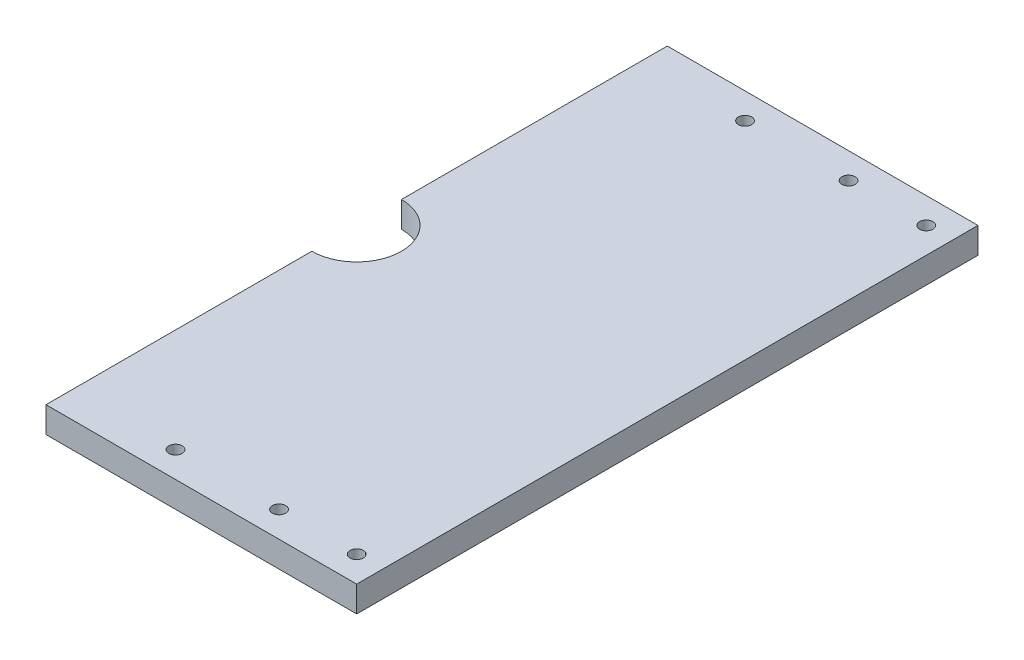
ISO-10303-21;
HEADER;
FILE_DESCRIPTION(('STEP AP214'),'2;1');
FILE_NAME('part.step','',(''),(''),'','','');
FILE_SCHEMA(('AUTOMOTIVE_DESIGN { 1 0 10303 214 1 1 1 1 }'));
ENDSEC;
DATA;
#1=APPLICATION_CONTEXT('core data for automotive mechanical design processes');
#2=APPLICATION_PROTOCOL_DEFINITION('international standard','automotive_design',2000,#1);
#3=PRODUCT_CONTEXT('',#1,'mechanical');
#4=PRODUCT('Part','Part','',(#3));
#5=PRODUCT_RELATED_PRODUCT_CATEGORY('part','',(#4));
#6=PRODUCT_DEFINITION_FORMATION('','',#4);
#7=PRODUCT_DEFINITION_CONTEXT('part definition',#1,'design');
#8=PRODUCT_DEFINITION('design','',#6,#7);
#9=PRODUCT_DEFINITION_SHAPE('','',#8);
#10=(LENGTH_UNIT() NAMED_UNIT(*) SI_UNIT(.MILLI.,.METRE.));
#11=(NAMED_UNIT(*) PLANE_ANGLE_UNIT() SI_UNIT($,.RADIAN.));
#12=(NAMED_UNIT(*) SI_UNIT($,.STERADIAN.) SOLID_ANGLE_UNIT());
#13=UNCERTAINTY_MEASURE_WITH_UNIT(LENGTH_MEASURE(1.E-05),#10,'distance_accuracy_value','');
#14=(GEOMETRIC_REPRESENTATION_CONTEXT(3) GLOBAL_UNCERTAINTY_ASSIGNED_CONTEXT((#13)) GLOBAL_UNIT_ASSIGNED_CONTEXT((#10,
#11,#12)) REPRESENTATION_CONTEXT('',''));
#15=CARTESIAN_POINT('',(0.,0.,0.));
#16=DIRECTION('',(0.,0.,1.));
#17=DIRECTION('',(1.,0.,0.));
#18=AXIS2_PLACEMENT_3D('',#15,#16,#17);
#19=CARTESIAN_POINT('',(0.,6.35,0.));
#20=DIRECTION('',(0.,1.,0.));
#21=DIRECTION('',(0.,0.,1.));
#22=AXIS2_PLACEMENT_3D('',#19,#20,#21);
#23=PLANE('',#22);
#24=CARTESIAN_POINT('',(50.82,6.35,69.85));
#25=DIRECTION('',(0.,1.,0.));
#26=DIRECTION('',(0.,0.,-1.));
#27=AXIS2_PLACEMENT_3D('',#24,#25,#26);
#28=CIRCLE('',#27,1.63194999999999);
#29=CARTESIAN_POINT('',(50.82,6.35,68.21805));
#30=VERTEX_POINT('',#29);
#31=EDGE_CURVE('E220',#30,#30,#28,.T.);
#32=ORIENTED_EDGE('',*,*,#31,.F.);
#33=EDGE_LOOP('',(#32));
#34=FACE_BOUND('',#33,.T.);
#35=CARTESIAN_POINT('',(50.82,6.35,-69.85));
#36=DIRECTION('',(0.,1.,0.));
#37=DIRECTION('',(0.,0.,1.));
#38=AXIS2_PLACEMENT_3D('',#35,#36,#37);
#39=CIRCLE('',#38,1.63194999999999);
#40=CARTESIAN_POINT('',(50.82,6.35,-68.21805));
#41=VERTEX_POINT('',#40);
#42=EDGE_CURVE('E236',#41,#41,#39,.T.);
#43=ORIENTED_EDGE('',*,*,#42,.F.);
#44=EDGE_LOOP('',(#43));
#45=FACE_BOUND('',#44,.T.);
#46=CARTESIAN_POINT('',(69.87,6.35,-69.85));
#47=DIRECTION('',(0.,1.,0.));
#48=DIRECTION('',(0.,0.,1.));
#49=AXIS2_PLACEMENT_3D('',#46,#47,#48);
#50=CIRCLE('',#49,1.63194999999999);
#51=CARTESIAN_POINT('',(69.87,6.35,-68.21805));
#52=VERTEX_POINT('',#51);
#53=EDGE_CURVE('E134',#52,#52,#50,.T.);
#54=ORIENTED_EDGE('',*,*,#53,.F.);
#55=EDGE_LOOP('',(#54));
#56=FACE_BOUND('',#55,.T.);
#57=DIRECTION('',(0.,0.,1.));
#58=VECTOR('',#57,1.);
#59=CARTESIAN_POINT('',(0.,6.35,-76.2));
#60=LINE('',#59,#58);
#61=CARTESIAN_POINT('',(0.,6.35,-76.2));
#62=VERTEX_POINT('',#61);
#63=CARTESIAN_POINT('',(0.,6.35,-11.));
#64=VERTEX_POINT('',#63);
#65=EDGE_CURVE('E146',#62,#64,#60,.T.);
#66=ORIENTED_EDGE('',*,*,#65,.T.);
#67=CARTESIAN_POINT('',(0.,6.35,0.));
#68=DIRECTION('',(0.,-1.,0.));
#69=DIRECTION('',(0.,0.,1.));
#70=AXIS2_PLACEMENT_3D('',#67,#68,#69);
#71=CIRCLE('',#70,11.);
#72=CARTESIAN_POINT('',(0.,6.35,11.));
#73=VERTEX_POINT('',#72);
#74=EDGE_CURVE('E94',#64,#73,#71,.T.);
#75=ORIENTED_EDGE('',*,*,#74,.T.);
#76=DIRECTION('',(0.,0.,1.));
#77=VECTOR('',#76,1.);
#78=CARTESIAN_POINT('',(0.,6.35,11.));
#79=LINE('',#78,#77);
#80=CARTESIAN_POINT('',(0.,6.35,76.2));
#81=VERTEX_POINT('',#80);
#82=EDGE_CURVE('E107',#73,#81,#79,.T.);
#83=ORIENTED_EDGE('',*,*,#82,.T.);
#84=DIRECTION('',(1.,0.,0.));
#85=VECTOR('',#84,1.);
#86=CARTESIAN_POINT('',(0.,6.35,76.2));
#87=LINE('',#86,#85);
#88=CARTESIAN_POINT('',(76.22,6.35,76.2));
#89=VERTEX_POINT('',#88);
#90=EDGE_CURVE('E101',#81,#89,#87,.T.);
#91=ORIENTED_EDGE('',*,*,#90,.T.);
#92=DIRECTION('',(0.,0.,-1.));
#93=VECTOR('',#92,1.);
#94=CARTESIAN_POINT('',(76.22,6.35,-76.2));
#95=LINE('',#94,#93);
#96=CARTESIAN_POINT('',(76.22,6.35,-76.2));
#97=VERTEX_POINT('',#96);
#98=EDGE_CURVE('E105',#89,#97,#95,.T.);
#99=ORIENTED_EDGE('',*,*,#98,.T.);
#100=DIRECTION('',(-1.,0.,0.));
#101=VECTOR('',#100,1.);
#102=CARTESIAN_POINT('',(0.,6.35,-76.2));
#103=LINE('',#102,#101);
#104=EDGE_CURVE('E57',#97,#62,#103,.T.);
#105=ORIENTED_EDGE('',*,*,#104,.T.);
#106=EDGE_LOOP('',(#66,#75,#83,#91,#99,#105));
#107=FACE_BOUND('',#106,.T.);
#108=CARTESIAN_POINT('',(69.87,6.35,69.85));
#109=DIRECTION('',(0.,1.,0.));
#110=DIRECTION('',(0.,0.,-1.));
#111=AXIS2_PLACEMENT_3D('',#108,#109,#110);
#112=CIRCLE('',#111,1.63194999999999);
#113=CARTESIAN_POINT('',(69.87,6.35,68.21805));
#114=VERTEX_POINT('',#113);
#115=EDGE_CURVE('E244',#114,#114,#112,.T.);
#116=ORIENTED_EDGE('',*,*,#115,.F.);
#117=EDGE_LOOP('',(#116));
#118=FACE_BOUND('',#117,.T.);
#119=CARTESIAN_POINT('',(25.42,6.35,-69.85));
#120=DIRECTION('',(0.,1.,0.));
#121=DIRECTION('',(0.,0.,1.));
#122=AXIS2_PLACEMENT_3D('',#119,#120,#121);
#123=CIRCLE('',#122,1.63195);
#124=CARTESIAN_POINT('',(25.42,6.35,-68.21805));
#125=VERTEX_POINT('',#124);
#126=EDGE_CURVE('E228',#125,#125,#123,.T.);
#127=ORIENTED_EDGE('',*,*,#126,.F.);
#128=EDGE_LOOP('',(#127));
#129=FACE_BOUND('',#128,.T.);
#130=CARTESIAN_POINT('',(25.42,6.35,69.85));
#131=DIRECTION('',(0.,1.,0.));
#132=DIRECTION('',(0.,0.,-1.));
#133=AXIS2_PLACEMENT_3D('',#130,#131,#132);
#134=CIRCLE('',#133,1.63195);
#135=CARTESIAN_POINT('',(25.42,6.35,68.21805));
#136=VERTEX_POINT('',#135);
#137=EDGE_CURVE('E209',#136,#136,#134,.T.);
#138=ORIENTED_EDGE('',*,*,#137,.F.);
#139=EDGE_LOOP('',(#138));
#140=FACE_BOUND('',#139,.T.);
#141=ADVANCED_FACE('F39',(#34,#45,#56,#107,#118,#129,#140),#23,.T.);
#142=CARTESIAN_POINT('',(0.,0.,0.));
#143=DIRECTION('',(0.,1.,0.));
#144=DIRECTION('',(0.,0.,1.));
#145=AXIS2_PLACEMENT_3D('',#142,#143,#144);
#146=PLANE('',#145);
#147=DIRECTION('',(0.,0.,1.));
#148=VECTOR('',#147,1.);
#149=CARTESIAN_POINT('',(0.,0.,-76.2));
#150=LINE('',#149,#148);
#151=CARTESIAN_POINT('',(0.,0.,-76.2));
#152=VERTEX_POINT('',#151);
#153=CARTESIAN_POINT('',(0.,0.,-11.));
#154=VERTEX_POINT('',#153);
#155=EDGE_CURVE('E129',#152,#154,#150,.T.);
#156=ORIENTED_EDGE('',*,*,#155,.F.);
#157=DIRECTION('',(-1.,0.,0.));
#158=VECTOR('',#157,1.);
#159=CARTESIAN_POINT('',(0.,0.,-76.2));
#160=LINE('',#159,#158);
#161=CARTESIAN_POINT('',(76.22,0.,-76.2));
#162=VERTEX_POINT('',#161);
#163=EDGE_CURVE('E86',#162,#152,#160,.T.);
#164=ORIENTED_EDGE('',*,*,#163,.F.);
#165=DIRECTION('',(0.,0.,-1.));
#166=VECTOR('',#165,1.);
#167=CARTESIAN_POINT('',(76.22,0.,-76.2));
#168=LINE('',#167,#166);
#169=CARTESIAN_POINT('',(76.22,0.,76.2));
#170=VERTEX_POINT('',#169);
#171=EDGE_CURVE('E80',#170,#162,#168,.T.);
#172=ORIENTED_EDGE('',*,*,#171,.F.);
#173=DIRECTION('',(1.,0.,0.));
#174=VECTOR('',#173,1.);
#175=CARTESIAN_POINT('',(0.,0.,76.2));
#176=LINE('',#175,#174);
#177=CARTESIAN_POINT('',(0.,0.,76.2));
#178=VERTEX_POINT('',#177);
#179=EDGE_CURVE('E116',#178,#170,#176,.T.);
#180=ORIENTED_EDGE('',*,*,#179,.F.);
#181=DIRECTION('',(0.,0.,1.));
#182=VECTOR('',#181,1.);
#183=CARTESIAN_POINT('',(0.,0.,11.));
#184=LINE('',#183,#182);
#185=CARTESIAN_POINT('',(0.,0.,11.));
#186=VERTEX_POINT('',#185);
#187=EDGE_CURVE('E137',#186,#178,#184,.T.);
#188=ORIENTED_EDGE('',*,*,#187,.F.);
#189=CARTESIAN_POINT('',(0.,0.,0.));
#190=DIRECTION('',(0.,-1.,0.));
#191=DIRECTION('',(0.,0.,1.));
#192=AXIS2_PLACEMENT_3D('',#189,#190,#191);
#193=CIRCLE('',#192,11.);
#194=EDGE_CURVE('E133',#154,#186,#193,.T.);
#195=ORIENTED_EDGE('',*,*,#194,.F.);
#196=EDGE_LOOP('',(#156,#164,#172,#180,#188,#195));
#197=FACE_BOUND('',#196,.T.);
#198=CARTESIAN_POINT('',(69.87,0.,-69.85));
#199=DIRECTION('',(0.,1.,0.));
#200=DIRECTION('',(0.,0.,1.));
#201=AXIS2_PLACEMENT_3D('',#198,#199,#200);
#202=CIRCLE('',#201,1.63194999999999);
#203=CARTESIAN_POINT('',(69.87,0.,-68.21805));
#204=VERTEX_POINT('',#203);
#205=EDGE_CURVE('E248',#204,#204,#202,.T.);
#206=ORIENTED_EDGE('',*,*,#205,.T.);
#207=EDGE_LOOP('',(#206));
#208=FACE_BOUND('',#207,.T.);
#209=CARTESIAN_POINT('',(69.87,0.,69.85));
#210=DIRECTION('',(0.,1.,0.));
#211=DIRECTION('',(0.,0.,-1.));
#212=AXIS2_PLACEMENT_3D('',#209,#210,#211);
#213=CIRCLE('',#212,1.63194999999999);
#214=CARTESIAN_POINT('',(69.87,0.,68.21805));
#215=VERTEX_POINT('',#214);
#216=EDGE_CURVE('E240',#215,#215,#213,.T.);
#217=ORIENTED_EDGE('',*,*,#216,.T.);
#218=EDGE_LOOP('',(#217));
#219=FACE_BOUND('',#218,.T.);
#220=CARTESIAN_POINT('',(50.82,0.,-69.85));
#221=DIRECTION('',(0.,1.,0.));
#222=DIRECTION('',(0.,0.,1.));
#223=AXIS2_PLACEMENT_3D('',#220,#221,#222);
#224=CIRCLE('',#223,1.63194999999999);
#225=CARTESIAN_POINT('',(50.82,0.,-68.21805));
#226=VERTEX_POINT('',#225);
#227=EDGE_CURVE('E232',#226,#226,#224,.T.);
#228=ORIENTED_EDGE('',*,*,#227,.T.);
#229=EDGE_LOOP('',(#228));
#230=FACE_BOUND('',#229,.T.);
#231=CARTESIAN_POINT('',(25.42,0.,-69.85));
#232=DIRECTION('',(0.,1.,0.));
#233=DIRECTION('',(0.,0.,1.));
#234=AXIS2_PLACEMENT_3D('',#231,#232,#233);
#235=CIRCLE('',#234,1.63195);
#236=CARTESIAN_POINT('',(25.42,0.,-68.21805));
#237=VERTEX_POINT('',#236);
#238=EDGE_CURVE('E224',#237,#237,#235,.T.);
#239=ORIENTED_EDGE('',*,*,#238,.T.);
#240=EDGE_LOOP('',(#239));
#241=FACE_BOUND('',#240,.T.);
#242=CARTESIAN_POINT('',(50.82,0.,69.85));
#243=DIRECTION('',(0.,1.,0.));
#244=DIRECTION('',(0.,0.,-1.));
#245=AXIS2_PLACEMENT_3D('',#242,#243,#244);
#246=CIRCLE('',#245,1.63194999999999);
#247=CARTESIAN_POINT('',(50.82,0.,68.21805));
#248=VERTEX_POINT('',#247);
#249=EDGE_CURVE('E217',#248,#248,#246,.T.);
#250=ORIENTED_EDGE('',*,*,#249,.T.);
#251=EDGE_LOOP('',(#250));
#252=FACE_BOUND('',#251,.T.);
#253=CARTESIAN_POINT('',(25.42,0.,69.85));
#254=DIRECTION('',(0.,1.,0.));
#255=DIRECTION('',(0.,0.,-1.));
#256=AXIS2_PLACEMENT_3D('',#253,#254,#255);
#257=CIRCLE('',#256,1.63195);
#258=CARTESIAN_POINT('',(25.42,0.,68.21805));
#259=VERTEX_POINT('',#258);
#260=EDGE_CURVE('E212',#259,#259,#257,.T.);
#261=ORIENTED_EDGE('',*,*,#260,.T.);
#262=EDGE_LOOP('',(#261));
#263=FACE_BOUND('',#262,.T.);
#264=ADVANCED_FACE('F159',(#197,#208,#219,#230,#241,#252,#263),#146,.F.);
#265=CARTESIAN_POINT('',(0.,6.35,-76.2));
#266=DIRECTION('',(1.,0.,0.));
#267=DIRECTION('',(0.,0.,-1.));
#268=AXIS2_PLACEMENT_3D('',#265,#266,#267);
#269=PLANE('',#268);
#270=ORIENTED_EDGE('',*,*,#155,.T.);
#271=DIRECTION('',(0.,-1.,0.));
#272=VECTOR('',#271,1.);
#273=CARTESIAN_POINT('',(0.,6.35,-11.));
#274=LINE('',#273,#272);
#275=EDGE_CURVE('E11',#64,#154,#274,.T.);
#276=ORIENTED_EDGE('',*,*,#275,.F.);
#277=ORIENTED_EDGE('',*,*,#65,.F.);
#278=DIRECTION('',(0.,-1.,0.));
#279=VECTOR('',#278,1.);
#280=CARTESIAN_POINT('',(0.,6.35,-76.2));
#281=LINE('',#280,#279);
#282=EDGE_CURVE('E125',#62,#152,#281,.T.);
#283=ORIENTED_EDGE('',*,*,#282,.T.);
#284=EDGE_LOOP('',(#270,#276,#277,#283));
#285=FACE_BOUND('',#284,.T.);
#286=ADVANCED_FACE('F41',(#285),#269,.F.);
#287=CARTESIAN_POINT('',(0.,6.35,0.));
#288=DIRECTION('',(0.,-1.,0.));
#289=DIRECTION('',(0.,0.,-1.));
#290=AXIS2_PLACEMENT_3D('',#287,#288,#289);
#291=CYLINDRICAL_SURFACE('',#290,11.);
#292=ORIENTED_EDGE('',*,*,#194,.T.);
#293=DIRECTION('',(0.,-1.,0.));
#294=VECTOR('',#293,1.);
#295=CARTESIAN_POINT('',(0.,6.35,11.));
#296=LINE('',#295,#294);
#297=EDGE_CURVE('E49',#73,#186,#296,.T.);
#298=ORIENTED_EDGE('',*,*,#297,.F.);
#299=ORIENTED_EDGE('',*,*,#74,.F.);
#300=ORIENTED_EDGE('',*,*,#275,.T.);
#301=EDGE_LOOP('',(#292,#298,#299,#300));
#302=FACE_BOUND('',#301,.T.);
#303=ADVANCED_FACE('F330',(#302),#291,.F.);
#304=CARTESIAN_POINT('',(0.,6.35,11.));
#305=DIRECTION('',(1.,0.,0.));
#306=DIRECTION('',(0.,0.,-1.));
#307=AXIS2_PLACEMENT_3D('',#304,#305,#306);
#308=PLANE('',#307);
#309=ORIENTED_EDGE('',*,*,#187,.T.);
#310=DIRECTION('',(0.,-1.,0.));
#311=VECTOR('',#310,1.);
#312=CARTESIAN_POINT('',(0.,6.35,76.2));
#313=LINE('',#312,#311);
#314=EDGE_CURVE('E118',#81,#178,#313,.T.);
#315=ORIENTED_EDGE('',*,*,#314,.F.);
#316=ORIENTED_EDGE('',*,*,#82,.F.);
#317=ORIENTED_EDGE('',*,*,#297,.T.);
#318=EDGE_LOOP('',(#309,#315,#316,#317));
#319=FACE_BOUND('',#318,.T.);
#320=ADVANCED_FACE('F156',(#319),#308,.F.);
#321=CARTESIAN_POINT('',(0.,6.35,76.2));
#322=DIRECTION('',(0.,0.,-1.));
#323=DIRECTION('',(-1.,0.,0.));
#324=AXIS2_PLACEMENT_3D('',#321,#322,#323);
#325=PLANE('',#324);
#326=ORIENTED_EDGE('',*,*,#179,.T.);
#327=DIRECTION('',(0.,-1.,0.));
#328=VECTOR('',#327,1.);
#329=CARTESIAN_POINT('',(76.22,6.35,76.2));
#330=LINE('',#329,#328);
#331=EDGE_CURVE('E113',#89,#170,#330,.T.);
#332=ORIENTED_EDGE('',*,*,#331,.F.);
#333=ORIENTED_EDGE('',*,*,#90,.F.);
#334=ORIENTED_EDGE('',*,*,#314,.T.);
#335=EDGE_LOOP('',(#326,#332,#333,#334));
#336=FACE_BOUND('',#335,.T.);
#337=ADVANCED_FACE('F114',(#336),#325,.F.);
#338=CARTESIAN_POINT('',(76.22,6.35,-76.2));
#339=DIRECTION('',(-1.,0.,0.));
#340=DIRECTION('',(0.,0.,1.));
#341=AXIS2_PLACEMENT_3D('',#338,#339,#340);
#342=PLANE('',#341);
#343=ORIENTED_EDGE('',*,*,#171,.T.);
#344=DIRECTION('',(0.,-1.,0.));
#345=VECTOR('',#344,1.);
#346=CARTESIAN_POINT('',(76.22,6.35,-76.2));
#347=LINE('',#346,#345);
#348=EDGE_CURVE('E119',#97,#162,#347,.T.);
#349=ORIENTED_EDGE('',*,*,#348,.F.);
#350=ORIENTED_EDGE('',*,*,#98,.F.);
#351=ORIENTED_EDGE('',*,*,#331,.T.);
#352=EDGE_LOOP('',(#343,#349,#350,#351));
#353=FACE_BOUND('',#352,.T.);
#354=ADVANCED_FACE('F121',(#353),#342,.F.);
#355=CARTESIAN_POINT('',(0.,6.35,-76.2));
#356=DIRECTION('',(0.,0.,1.));
#357=DIRECTION('',(1.,0.,0.));
#358=AXIS2_PLACEMENT_3D('',#355,#356,#357);
#359=PLANE('',#358);
#360=ORIENTED_EDGE('',*,*,#163,.T.);
#361=ORIENTED_EDGE('',*,*,#282,.F.);
#362=ORIENTED_EDGE('',*,*,#104,.F.);
#363=ORIENTED_EDGE('',*,*,#348,.T.);
#364=EDGE_LOOP('',(#360,#361,#362,#363));
#365=FACE_BOUND('',#364,.T.);
#366=ADVANCED_FACE('F164',(#365),#359,.F.);
#367=CARTESIAN_POINT('',(69.87,6.35,-69.85));
#368=DIRECTION('',(0.,-1.,0.));
#369=DIRECTION('',(0.,0.,-1.));
#370=AXIS2_PLACEMENT_3D('',#367,#368,#369);
#371=CYLINDRICAL_SURFACE('',#370,1.63194999999999);
#372=ORIENTED_EDGE('',*,*,#53,.T.);
#373=EDGE_LOOP('',(#372));
#374=FACE_BOUND('',#373,.T.);
#375=ORIENTED_EDGE('',*,*,#205,.F.);
#376=EDGE_LOOP('',(#375));
#377=FACE_BOUND('',#376,.T.);
#378=ADVANCED_FACE('F166',(#374,#377),#371,.F.);
#379=CARTESIAN_POINT('',(69.87,6.35,69.85));
#380=DIRECTION('',(0.,-1.,0.));
#381=DIRECTION('',(0.,0.,-1.));
#382=AXIS2_PLACEMENT_3D('',#379,#380,#381);
#383=CYLINDRICAL_SURFACE('',#382,1.63194999999999);
#384=ORIENTED_EDGE('',*,*,#115,.T.);
#385=EDGE_LOOP('',(#384));
#386=FACE_BOUND('',#385,.T.);
#387=ORIENTED_EDGE('',*,*,#216,.F.);
#388=EDGE_LOOP('',(#387));
#389=FACE_BOUND('',#388,.T.);
#390=ADVANCED_FACE('F172',(#386,#389),#383,.F.);
#391=CARTESIAN_POINT('',(50.82,6.35,-69.85));
#392=DIRECTION('',(0.,-1.,0.));
#393=DIRECTION('',(0.,0.,-1.));
#394=AXIS2_PLACEMENT_3D('',#391,#392,#393);
#395=CYLINDRICAL_SURFACE('',#394,1.63194999999999);
#396=ORIENTED_EDGE('',*,*,#42,.T.);
#397=EDGE_LOOP('',(#396));
#398=FACE_BOUND('',#397,.T.);
#399=ORIENTED_EDGE('',*,*,#227,.F.);
#400=EDGE_LOOP('',(#399));
#401=FACE_BOUND('',#400,.T.);
#402=ADVANCED_FACE('F188',(#398,#401),#395,.F.);
#403=CARTESIAN_POINT('',(25.42,6.35,-69.85));
#404=DIRECTION('',(0.,-1.,0.));
#405=DIRECTION('',(0.,0.,-1.));
#406=AXIS2_PLACEMENT_3D('',#403,#404,#405);
#407=CYLINDRICAL_SURFACE('',#406,1.63195);
#408=ORIENTED_EDGE('',*,*,#126,.T.);
#409=EDGE_LOOP('',(#408));
#410=FACE_BOUND('',#409,.T.);
#411=ORIENTED_EDGE('',*,*,#238,.F.);
#412=EDGE_LOOP('',(#411));
#413=FACE_BOUND('',#412,.T.);
#414=ADVANCED_FACE('F192',(#410,#413),#407,.F.);
#415=CARTESIAN_POINT('',(50.82,6.35,69.85));
#416=DIRECTION('',(0.,-1.,0.));
#417=DIRECTION('',(0.,0.,-1.));
#418=AXIS2_PLACEMENT_3D('',#415,#416,#417);
#419=CYLINDRICAL_SURFACE('',#418,1.63194999999999);
#420=ORIENTED_EDGE('',*,*,#31,.T.);
#421=EDGE_LOOP('',(#420));
#422=FACE_BOUND('',#421,.T.);
#423=ORIENTED_EDGE('',*,*,#249,.F.);
#424=EDGE_LOOP('',(#423));
#425=FACE_BOUND('',#424,.T.);
#426=ADVANCED_FACE('F196',(#422,#425),#419,.F.);
#427=CARTESIAN_POINT('',(25.42,6.35,69.85));
#428=DIRECTION('',(0.,-1.,0.));
#429=DIRECTION('',(0.,0.,-1.));
#430=AXIS2_PLACEMENT_3D('',#427,#428,#429);
#431=CYLINDRICAL_SURFACE('',#430,1.63195);
#432=ORIENTED_EDGE('',*,*,#137,.T.);
#433=EDGE_LOOP('',(#432));
#434=FACE_BOUND('',#433,.T.);
#435=ORIENTED_EDGE('',*,*,#260,.F.);
#436=EDGE_LOOP('',(#435));
#437=FACE_BOUND('',#436,.T.);
#438=ADVANCED_FACE('F200',(#434,#437),#431,.F.);
#439=CLOSED_SHELL('',(#141,#264,#286,#303,#320,#337,#354,#366,#378,#390,#402,#414,#426,#438));
#440=MANIFOLD_SOLID_BREP('B2',#439);
#441=ADVANCED_BREP_SHAPE_REPRESENTATION('',(#18,#440),#14);
#442=SHAPE_DEFINITION_REPRESENTATION(#9,#441);
ENDSEC;
END-ISO-10303-21;
